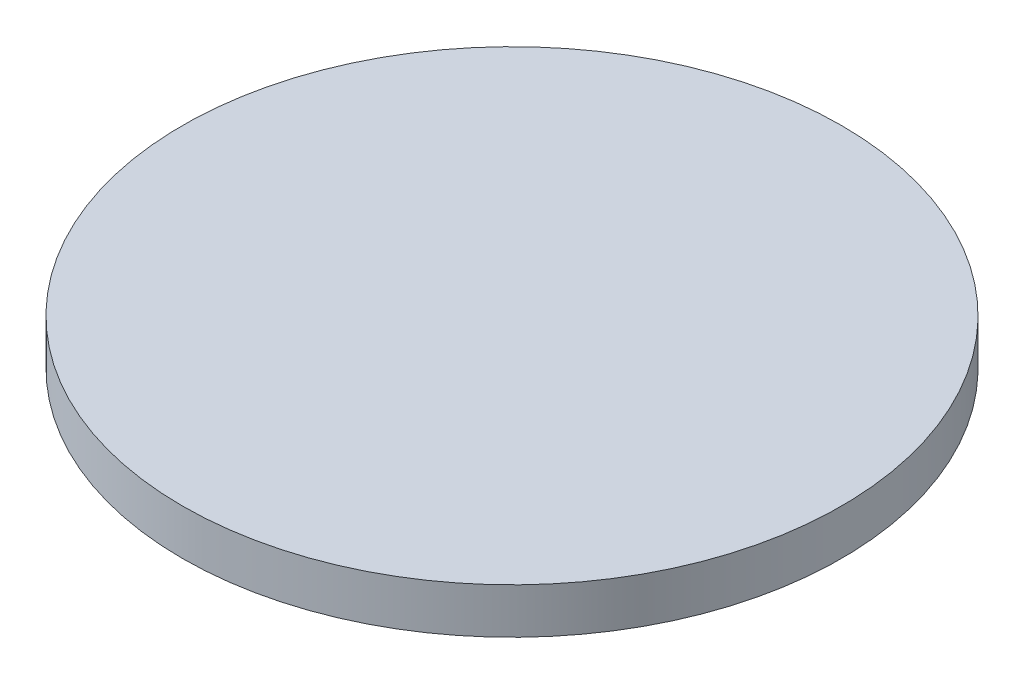
ISO-10303-21;
HEADER;
FILE_DESCRIPTION(('STEP AP214'),'2;1');
FILE_NAME('part.step','',(''),(''),'','','');
FILE_SCHEMA(('AUTOMOTIVE_DESIGN { 1 0 10303 214 1 1 1 1 }'));
ENDSEC;
DATA;
#1=APPLICATION_CONTEXT('core data for automotive mechanical design processes');
#2=APPLICATION_PROTOCOL_DEFINITION('international standard','automotive_design',2000,#1);
#3=PRODUCT_CONTEXT('',#1,'mechanical');
#4=PRODUCT('Part','Part','',(#3));
#5=PRODUCT_RELATED_PRODUCT_CATEGORY('part','',(#4));
#6=PRODUCT_DEFINITION_FORMATION('','',#4);
#7=PRODUCT_DEFINITION_CONTEXT('part definition',#1,'design');
#8=PRODUCT_DEFINITION('design','',#6,#7);
#9=PRODUCT_DEFINITION_SHAPE('','',#8);
#10=(LENGTH_UNIT() NAMED_UNIT(*) SI_UNIT(.MILLI.,.METRE.));
#11=(NAMED_UNIT(*) PLANE_ANGLE_UNIT() SI_UNIT($,.RADIAN.));
#12=(NAMED_UNIT(*) SI_UNIT($,.STERADIAN.) SOLID_ANGLE_UNIT());
#13=UNCERTAINTY_MEASURE_WITH_UNIT(LENGTH_MEASURE(1.E-05),#10,'distance_accuracy_value','');
#14=(GEOMETRIC_REPRESENTATION_CONTEXT(3) GLOBAL_UNCERTAINTY_ASSIGNED_CONTEXT((#13)) GLOBAL_UNIT_ASSIGNED_CONTEXT((#10,
#11,#12)) REPRESENTATION_CONTEXT('',''));
#15=CARTESIAN_POINT('',(0.,0.,0.));
#16=DIRECTION('',(0.,0.,1.));
#17=DIRECTION('',(1.,0.,0.));
#18=AXIS2_PLACEMENT_3D('',#15,#16,#17);
#19=CARTESIAN_POINT('',(63.8175,-3.175,-63.8175));
#20=DIRECTION('',(0.,1.,0.));
#21=DIRECTION('',(0.,0.,1.));
#22=AXIS2_PLACEMENT_3D('',#19,#20,#21);
#23=CYLINDRICAL_SURFACE('',#22,92.075);
#24=CARTESIAN_POINT('',(63.8175,-3.175,-63.8175));
#25=DIRECTION('',(0.,1.,0.));
#26=DIRECTION('',(0.,0.,1.));
#27=AXIS2_PLACEMENT_3D('',#24,#25,#26);
#28=CIRCLE('',#27,92.075);
#29=CARTESIAN_POINT('',(63.8175,-3.175,28.2575));
#30=VERTEX_POINT('',#29);
#31=EDGE_CURVE('E10',#30,#30,#28,.T.);
#32=ORIENTED_EDGE('',*,*,#31,.T.);
#33=EDGE_LOOP('',(#32));
#34=FACE_BOUND('',#33,.T.);
#35=CARTESIAN_POINT('',(63.8175,9.525,-63.8175));
#36=DIRECTION('',(0.,1.,0.));
#37=DIRECTION('',(0.,0.,1.));
#38=AXIS2_PLACEMENT_3D('',#35,#36,#37);
#39=CIRCLE('',#38,92.075);
#40=CARTESIAN_POINT('',(63.8175,9.525,28.2575));
#41=VERTEX_POINT('',#40);
#42=EDGE_CURVE('E43',#41,#41,#39,.T.);
#43=ORIENTED_EDGE('',*,*,#42,.F.);
#44=EDGE_LOOP('',(#43));
#45=FACE_BOUND('',#44,.T.);
#46=ADVANCED_FACE('F39',(#34,#45),#23,.T.);
#47=CARTESIAN_POINT('',(63.8175,-3.175,-63.8175));
#48=DIRECTION('',(0.,1.,0.));
#49=DIRECTION('',(0.,0.,1.));
#50=AXIS2_PLACEMENT_3D('',#47,#48,#49);
#51=PLANE('',#50);
#52=ORIENTED_EDGE('',*,*,#31,.F.);
#53=EDGE_LOOP('',(#52));
#54=FACE_BOUND('',#53,.T.);
#55=ADVANCED_FACE('F56',(#54),#51,.F.);
#56=CARTESIAN_POINT('',(0.,9.525,0.));
#57=DIRECTION('',(0.,-1.,0.));
#58=DIRECTION('',(0.,0.,-1.));
#59=AXIS2_PLACEMENT_3D('',#56,#57,#58);
#60=PLANE('',#59);
#61=ORIENTED_EDGE('',*,*,#42,.T.);
#62=EDGE_LOOP('',(#61));
#63=FACE_BOUND('',#62,.T.);
#64=ADVANCED_FACE('F41',(#63),#60,.F.);
#65=CLOSED_SHELL('',(#46,#55,#64));
#66=MANIFOLD_SOLID_BREP('B2',#65);
#67=ADVANCED_BREP_SHAPE_REPRESENTATION('',(#18,#66),#14);
#68=SHAPE_DEFINITION_REPRESENTATION(#9,#67);
ENDSEC;
END-ISO-10303-21;
